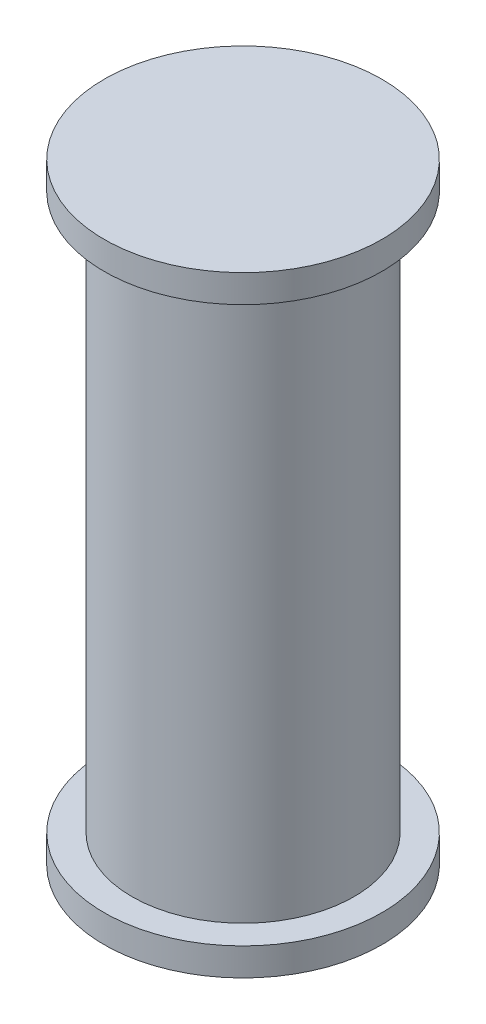
ISO-10303-21;
HEADER;
FILE_DESCRIPTION(('STEP AP214'),'2;1');
FILE_NAME('part.step','',(''),(''),'','','');
FILE_SCHEMA(('AUTOMOTIVE_DESIGN { 1 0 10303 214 1 1 1 1 }'));
ENDSEC;
DATA;
#1=APPLICATION_CONTEXT('core data for automotive mechanical design processes');
#2=APPLICATION_PROTOCOL_DEFINITION('international standard','automotive_design',2000,#1);
#3=PRODUCT_CONTEXT('',#1,'mechanical');
#4=PRODUCT('Part','Part','',(#3));
#5=PRODUCT_RELATED_PRODUCT_CATEGORY('part','',(#4));
#6=PRODUCT_DEFINITION_FORMATION('','',#4);
#7=PRODUCT_DEFINITION_CONTEXT('part definition',#1,'design');
#8=PRODUCT_DEFINITION('design','',#6,#7);
#9=PRODUCT_DEFINITION_SHAPE('','',#8);
#10=(LENGTH_UNIT() NAMED_UNIT(*) SI_UNIT(.MILLI.,.METRE.));
#11=(NAMED_UNIT(*) PLANE_ANGLE_UNIT() SI_UNIT($,.RADIAN.));
#12=(NAMED_UNIT(*) SI_UNIT($,.STERADIAN.) SOLID_ANGLE_UNIT());
#13=UNCERTAINTY_MEASURE_WITH_UNIT(LENGTH_MEASURE(1.E-05),#10,'distance_accuracy_value','');
#14=(GEOMETRIC_REPRESENTATION_CONTEXT(3) GLOBAL_UNCERTAINTY_ASSIGNED_CONTEXT((#13)) GLOBAL_UNIT_ASSIGNED_CONTEXT((#10,
#11,#12)) REPRESENTATION_CONTEXT('',''));
#15=CARTESIAN_POINT('',(0.,0.,0.));
#16=DIRECTION('',(0.,0.,1.));
#17=DIRECTION('',(1.,0.,0.));
#18=AXIS2_PLACEMENT_3D('',#15,#16,#17);
#19=CARTESIAN_POINT('',(0.,-10.,5.));
#20=DIRECTION('',(0.,-1.,0.));
#21=DIRECTION('',(0.,0.,-1.));
#22=AXIS2_PLACEMENT_3D('',#19,#20,#21);
#23=PLANE('',#22);
#24=CARTESIAN_POINT('',(0.,-10.,0.));
#25=DIRECTION('',(0.,-1.,0.));
#26=DIRECTION('',(0.,0.,-1.));
#27=AXIS2_PLACEMENT_3D('',#24,#25,#26);
#28=CIRCLE('',#27,5.);
#29=CARTESIAN_POINT('',(0.,-10.,-5.));
#30=VERTEX_POINT('',#29);
#31=EDGE_CURVE('E10',#30,#30,#28,.T.);
#32=ORIENTED_EDGE('',*,*,#31,.F.);
#33=EDGE_LOOP('',(#32));
#34=FACE_BOUND('',#33,.T.);
#35=CARTESIAN_POINT('',(0.,-10.,0.));
#36=DIRECTION('',(0.,-1.,0.));
#37=DIRECTION('',(0.,0.,-1.));
#38=AXIS2_PLACEMENT_3D('',#35,#36,#37);
#39=CIRCLE('',#38,4.);
#40=CARTESIAN_POINT('',(0.,-10.,-4.));
#41=VERTEX_POINT('',#40);
#42=EDGE_CURVE('E63',#41,#41,#39,.T.);
#43=ORIENTED_EDGE('',*,*,#42,.T.);
#44=EDGE_LOOP('',(#43));
#45=FACE_BOUND('',#44,.T.);
#46=ADVANCED_FACE('F39',(#34,#45),#23,.F.);
#47=CARTESIAN_POINT('',(0.,-12.0734241758242,0.));
#48=DIRECTION('',(0.,-1.,0.));
#49=DIRECTION('',(0.,0.,-1.));
#50=AXIS2_PLACEMENT_3D('',#47,#48,#49);
#51=CYLINDRICAL_SURFACE('',#50,5.);
#52=CARTESIAN_POINT('',(0.,-11.,0.));
#53=DIRECTION('',(0.,-1.,0.));
#54=DIRECTION('',(0.,0.,-1.));
#55=AXIS2_PLACEMENT_3D('',#52,#53,#54);
#56=CIRCLE('',#55,5.);
#57=CARTESIAN_POINT('',(0.,-11.,-5.));
#58=VERTEX_POINT('',#57);
#59=EDGE_CURVE('E44',#58,#58,#56,.T.);
#60=ORIENTED_EDGE('',*,*,#59,.F.);
#61=EDGE_LOOP('',(#60));
#62=FACE_BOUND('',#61,.T.);
#63=ORIENTED_EDGE('',*,*,#31,.T.);
#64=EDGE_LOOP('',(#63));
#65=FACE_BOUND('',#64,.T.);
#66=ADVANCED_FACE('F91',(#62,#65),#51,.T.);
#67=CARTESIAN_POINT('',(0.,-11.,0.));
#68=DIRECTION('',(0.,1.,0.));
#69=DIRECTION('',(0.,0.,1.));
#70=AXIS2_PLACEMENT_3D('',#67,#68,#69);
#71=PLANE('',#70);
#72=ORIENTED_EDGE('',*,*,#59,.T.);
#73=EDGE_LOOP('',(#72));
#74=FACE_BOUND('',#73,.T.);
#75=ADVANCED_FACE('F86',(#74),#71,.F.);
#76=CARTESIAN_POINT('',(0.,11.,5.));
#77=DIRECTION('',(0.,-1.,0.));
#78=DIRECTION('',(0.,0.,-1.));
#79=AXIS2_PLACEMENT_3D('',#76,#77,#78);
#80=PLANE('',#79);
#81=CARTESIAN_POINT('',(0.,11.,0.));
#82=DIRECTION('',(0.,-1.,0.));
#83=DIRECTION('',(0.,0.,-1.));
#84=AXIS2_PLACEMENT_3D('',#81,#82,#83);
#85=CIRCLE('',#84,5.);
#86=CARTESIAN_POINT('',(0.,11.,-5.));
#87=VERTEX_POINT('',#86);
#88=EDGE_CURVE('E47',#87,#87,#85,.T.);
#89=ORIENTED_EDGE('',*,*,#88,.F.);
#90=EDGE_LOOP('',(#89));
#91=FACE_BOUND('',#90,.T.);
#92=ADVANCED_FACE('F83',(#91),#80,.F.);
#93=CARTESIAN_POINT('',(0.,-12.0734241758242,0.));
#94=DIRECTION('',(0.,-1.,0.));
#95=DIRECTION('',(0.,0.,-1.));
#96=AXIS2_PLACEMENT_3D('',#93,#94,#95);
#97=CYLINDRICAL_SURFACE('',#96,5.);
#98=CARTESIAN_POINT('',(0.,10.,0.));
#99=DIRECTION('',(0.,-1.,0.));
#100=DIRECTION('',(0.,0.,-1.));
#101=AXIS2_PLACEMENT_3D('',#98,#99,#100);
#102=CIRCLE('',#101,5.);
#103=CARTESIAN_POINT('',(0.,10.,-5.));
#104=VERTEX_POINT('',#103);
#105=EDGE_CURVE('E52',#104,#104,#102,.T.);
#106=ORIENTED_EDGE('',*,*,#105,.F.);
#107=EDGE_LOOP('',(#106));
#108=FACE_BOUND('',#107,.T.);
#109=ORIENTED_EDGE('',*,*,#88,.T.);
#110=EDGE_LOOP('',(#109));
#111=FACE_BOUND('',#110,.T.);
#112=ADVANCED_FACE('F74',(#108,#111),#97,.T.);
#113=CARTESIAN_POINT('',(0.,10.,4.));
#114=DIRECTION('',(0.,1.,0.));
#115=DIRECTION('',(0.,0.,1.));
#116=AXIS2_PLACEMENT_3D('',#113,#114,#115);
#117=PLANE('',#116);
#118=CARTESIAN_POINT('',(0.,10.,0.));
#119=DIRECTION('',(0.,-1.,0.));
#120=DIRECTION('',(0.,0.,-1.));
#121=AXIS2_PLACEMENT_3D('',#118,#119,#120);
#122=CIRCLE('',#121,4.);
#123=CARTESIAN_POINT('',(0.,10.,-4.));
#124=VERTEX_POINT('',#123);
#125=EDGE_CURVE('E59',#124,#124,#122,.T.);
#126=ORIENTED_EDGE('',*,*,#125,.F.);
#127=EDGE_LOOP('',(#126));
#128=FACE_BOUND('',#127,.T.);
#129=ORIENTED_EDGE('',*,*,#105,.T.);
#130=EDGE_LOOP('',(#129));
#131=FACE_BOUND('',#130,.T.);
#132=ADVANCED_FACE('F69',(#128,#131),#117,.F.);
#133=CARTESIAN_POINT('',(0.,-12.0734241758242,0.));
#134=DIRECTION('',(0.,-1.,0.));
#135=DIRECTION('',(0.,0.,-1.));
#136=AXIS2_PLACEMENT_3D('',#133,#134,#135);
#137=CYLINDRICAL_SURFACE('',#136,4.);
#138=ORIENTED_EDGE('',*,*,#42,.F.);
#139=EDGE_LOOP('',(#138));
#140=FACE_BOUND('',#139,.T.);
#141=ORIENTED_EDGE('',*,*,#125,.T.);
#142=EDGE_LOOP('',(#141));
#143=FACE_BOUND('',#142,.T.);
#144=ADVANCED_FACE('F67',(#140,#143),#137,.T.);
#145=CLOSED_SHELL('',(#46,#66,#75,#92,#112,#132,#144));
#146=MANIFOLD_SOLID_BREP('B2',#145);
#147=ADVANCED_BREP_SHAPE_REPRESENTATION('',(#18,#146),#14);
#148=SHAPE_DEFINITION_REPRESENTATION(#9,#147);
ENDSEC;
END-ISO-10303-21;
